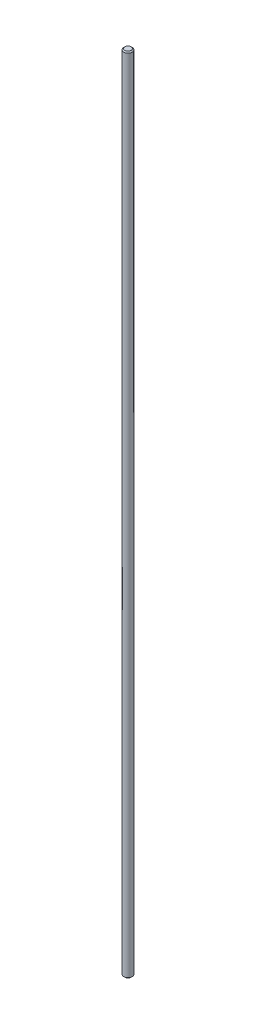
ISO-10303-21;
HEADER;
FILE_DESCRIPTION(('STEP AP214'),'2;1');
FILE_NAME('part.step','',(''),(''),'','','');
FILE_SCHEMA(('AUTOMOTIVE_DESIGN { 1 0 10303 214 1 1 1 1 }'));
ENDSEC;
DATA;
#1=APPLICATION_CONTEXT('core data for automotive mechanical design processes');
#2=APPLICATION_PROTOCOL_DEFINITION('international standard','automotive_design',2000,#1);
#3=PRODUCT_CONTEXT('',#1,'mechanical');
#4=PRODUCT('Part','Part','',(#3));
#5=PRODUCT_RELATED_PRODUCT_CATEGORY('part','',(#4));
#6=PRODUCT_DEFINITION_FORMATION('','',#4);
#7=PRODUCT_DEFINITION_CONTEXT('part definition',#1,'design');
#8=PRODUCT_DEFINITION('design','',#6,#7);
#9=PRODUCT_DEFINITION_SHAPE('','',#8);
#10=(LENGTH_UNIT() NAMED_UNIT(*) SI_UNIT(.MILLI.,.METRE.));
#11=(NAMED_UNIT(*) PLANE_ANGLE_UNIT() SI_UNIT($,.RADIAN.));
#12=(NAMED_UNIT(*) SI_UNIT($,.STERADIAN.) SOLID_ANGLE_UNIT());
#13=UNCERTAINTY_MEASURE_WITH_UNIT(LENGTH_MEASURE(1.E-05),#10,'distance_accuracy_value','');
#14=(GEOMETRIC_REPRESENTATION_CONTEXT(3) GLOBAL_UNCERTAINTY_ASSIGNED_CONTEXT((#13)) GLOBAL_UNIT_ASSIGNED_CONTEXT((#10,
#11,#12)) REPRESENTATION_CONTEXT('',''));
#15=CARTESIAN_POINT('',(0.,0.,0.));
#16=DIRECTION('',(0.,0.,1.));
#17=DIRECTION('',(1.,0.,0.));
#18=AXIS2_PLACEMENT_3D('',#15,#16,#17);
#19=CARTESIAN_POINT('',(0.,770.,0.));
#20=DIRECTION('',(0.,-1.,0.));
#21=DIRECTION('',(0.,0.,-1.));
#22=AXIS2_PLACEMENT_3D('',#19,#20,#21);
#23=CYLINDRICAL_SURFACE('',#22,4.);
#24=CARTESIAN_POINT('',(0.,1.00000000000011,0.));
#25=DIRECTION('',(0.,1.,0.));
#26=DIRECTION('',(0.,0.,1.));
#27=AXIS2_PLACEMENT_3D('',#24,#25,#26);
#28=CIRCLE('',#27,4.);
#29=CARTESIAN_POINT('',(0.,1.00000000000011,4.));
#30=VERTEX_POINT('',#29);
#31=EDGE_CURVE('E47',#30,#30,#28,.T.);
#32=ORIENTED_EDGE('',*,*,#31,.T.);
#33=EDGE_LOOP('',(#32));
#34=FACE_BOUND('',#33,.T.);
#35=CARTESIAN_POINT('',(0.,769.,0.));
#36=DIRECTION('',(0.,1.,0.));
#37=DIRECTION('',(0.,0.,1.));
#38=AXIS2_PLACEMENT_3D('',#35,#36,#37);
#39=CIRCLE('',#38,4.);
#40=CARTESIAN_POINT('',(0.,769.,4.));
#41=VERTEX_POINT('',#40);
#42=EDGE_CURVE('E51',#41,#41,#39,.F.);
#43=ORIENTED_EDGE('',*,*,#42,.T.);
#44=EDGE_LOOP('',(#43));
#45=FACE_BOUND('',#44,.T.);
#46=ADVANCED_FACE('F35',(#34,#45),#23,.T.);
#47=CARTESIAN_POINT('',(0.,770.,0.));
#48=DIRECTION('',(0.,1.,0.));
#49=DIRECTION('',(0.,0.,1.));
#50=AXIS2_PLACEMENT_3D('',#47,#48,#49);
#51=PLANE('',#50);
#52=CARTESIAN_POINT('',(0.,770.,0.));
#53=DIRECTION('',(0.,1.,0.));
#54=DIRECTION('',(0.,0.,1.));
#55=AXIS2_PLACEMENT_3D('',#52,#53,#54);
#56=CIRCLE('',#55,3.00000000000011);
#57=CARTESIAN_POINT('',(0.,770.,3.00000000000011));
#58=VERTEX_POINT('',#57);
#59=EDGE_CURVE('E10',#58,#58,#56,.T.);
#60=ORIENTED_EDGE('',*,*,#59,.T.);
#61=EDGE_LOOP('',(#60));
#62=FACE_BOUND('',#61,.T.);
#63=ADVANCED_FACE('F67',(#62),#51,.T.);
#64=CARTESIAN_POINT('',(0.,0.,0.));
#65=DIRECTION('',(0.,1.,0.));
#66=DIRECTION('',(0.,0.,1.));
#67=AXIS2_PLACEMENT_3D('',#64,#65,#66);
#68=PLANE('',#67);
#69=CARTESIAN_POINT('',(0.,0.,0.));
#70=DIRECTION('',(0.,1.,0.));
#71=DIRECTION('',(0.,0.,1.));
#72=AXIS2_PLACEMENT_3D('',#69,#70,#71);
#73=CIRCLE('',#72,2.99999999999989);
#74=CARTESIAN_POINT('',(0.,0.,2.99999999999989));
#75=VERTEX_POINT('',#74);
#76=EDGE_CURVE('E43',#75,#75,#73,.F.);
#77=ORIENTED_EDGE('',*,*,#76,.T.);
#78=EDGE_LOOP('',(#77));
#79=FACE_BOUND('',#78,.T.);
#80=ADVANCED_FACE('F64',(#79),#68,.F.);
#81=CARTESIAN_POINT('',(0.,1.00000000000011,0.));
#82=DIRECTION('',(0.,1.,0.));
#83=DIRECTION('',(0.,0.,1.));
#84=AXIS2_PLACEMENT_3D('',#81,#82,#83);
#85=CONICAL_SURFACE('',#84,4.,0.785398163397447);
#86=ORIENTED_EDGE('',*,*,#76,.F.);
#87=EDGE_LOOP('',(#86));
#88=FACE_BOUND('',#87,.T.);
#89=ORIENTED_EDGE('',*,*,#31,.F.);
#90=EDGE_LOOP('',(#89));
#91=FACE_BOUND('',#90,.T.);
#92=ADVANCED_FACE('F60',(#88,#91),#85,.T.);
#93=CARTESIAN_POINT('',(0.,770.,0.));
#94=DIRECTION('',(0.,-1.,0.));
#95=DIRECTION('',(0.,0.,-1.));
#96=AXIS2_PLACEMENT_3D('',#93,#94,#95);
#97=CONICAL_SURFACE('',#96,3.00000000000011,0.785398163397447);
#98=ORIENTED_EDGE('',*,*,#42,.F.);
#99=EDGE_LOOP('',(#98));
#100=FACE_BOUND('',#99,.T.);
#101=ORIENTED_EDGE('',*,*,#59,.F.);
#102=EDGE_LOOP('',(#101));
#103=FACE_BOUND('',#102,.T.);
#104=ADVANCED_FACE('F38',(#100,#103),#97,.T.);
#105=CLOSED_SHELL('',(#46,#63,#80,#92,#104));
#106=MANIFOLD_SOLID_BREP('B2',#105);
#107=ADVANCED_BREP_SHAPE_REPRESENTATION('',(#18,#106),#14);
#108=SHAPE_DEFINITION_REPRESENTATION(#9,#107);
ENDSEC;
END-ISO-10303-21;
